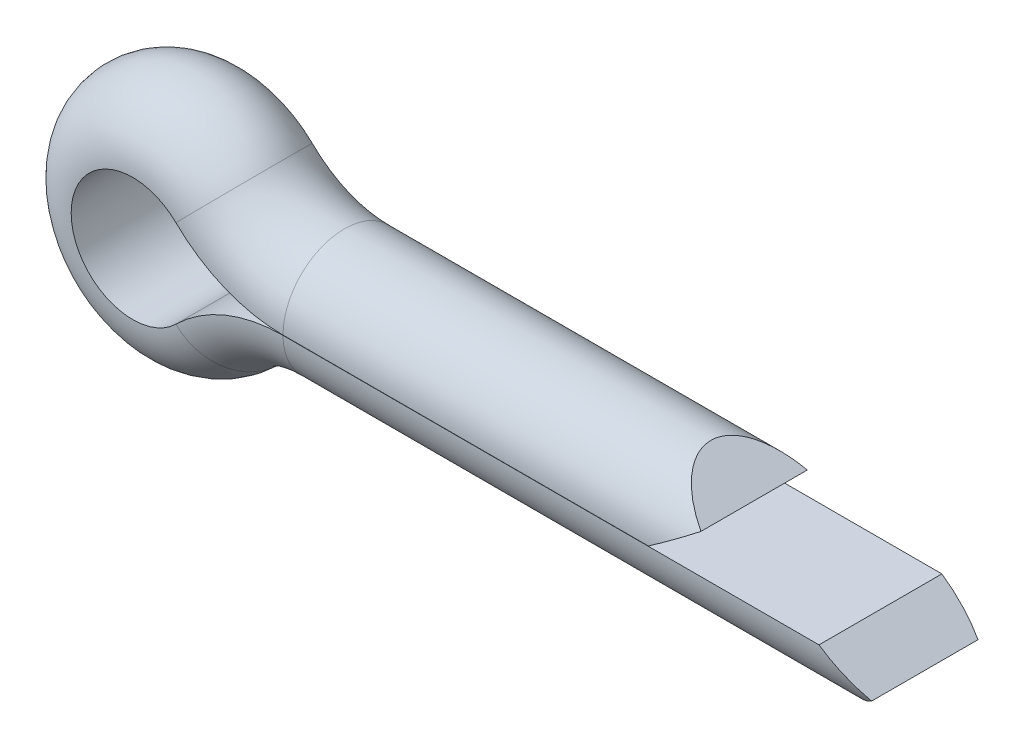
ISO-10303-21;
HEADER;
FILE_DESCRIPTION(('STEP AP214'),'2;1');
FILE_NAME('part.step','',(''),(''),'','','');
FILE_SCHEMA(('AUTOMOTIVE_DESIGN { 1 0 10303 214 1 1 1 1 }'));
ENDSEC;
DATA;
#1=APPLICATION_CONTEXT('core data for automotive mechanical design processes');
#2=APPLICATION_PROTOCOL_DEFINITION('international standard','automotive_design',2000,#1);
#3=PRODUCT_CONTEXT('',#1,'mechanical');
#4=PRODUCT('Part','Part','',(#3));
#5=PRODUCT_RELATED_PRODUCT_CATEGORY('part','',(#4));
#6=PRODUCT_DEFINITION_FORMATION('','',#4);
#7=PRODUCT_DEFINITION_CONTEXT('part definition',#1,'design');
#8=PRODUCT_DEFINITION('design','',#6,#7);
#9=PRODUCT_DEFINITION_SHAPE('','',#8);
#10=(LENGTH_UNIT() NAMED_UNIT(*) SI_UNIT(.MILLI.,.METRE.));
#11=(NAMED_UNIT(*) PLANE_ANGLE_UNIT() SI_UNIT($,.RADIAN.));
#12=(NAMED_UNIT(*) SI_UNIT($,.STERADIAN.) SOLID_ANGLE_UNIT());
#13=UNCERTAINTY_MEASURE_WITH_UNIT(LENGTH_MEASURE(1.E-05),#10,'distance_accuracy_value','');
#14=(GEOMETRIC_REPRESENTATION_CONTEXT(3) GLOBAL_UNCERTAINTY_ASSIGNED_CONTEXT((#13)) GLOBAL_UNIT_ASSIGNED_CONTEXT((#10,
#11,#12)) REPRESENTATION_CONTEXT('',''));
#15=CARTESIAN_POINT('',(0.,0.,0.));
#16=DIRECTION('',(0.,0.,1.));
#17=DIRECTION('',(1.,0.,0.));
#18=AXIS2_PLACEMENT_3D('',#15,#16,#17);
#19=CARTESIAN_POINT('',(0.,-0.00200000000000005,0.899997777775034));
#20=DIRECTION('',(0.,-1.,0.));
#21=DIRECTION('',(1.,0.,0.));
#22=AXIS2_PLACEMENT_3D('',#19,#20,#21);
#23=PLANE('',#22);
#24=DIRECTION('',(1.,0.,0.));
#25=VECTOR('',#24,1.);
#26=CARTESIAN_POINT('',(0.,-0.00200000000000005,0.899997777775034));
#27=LINE('',#26,#25);
#28=CARTESIAN_POINT('',(0.,-0.00200000000000005,0.899997777775034));
#29=VERTEX_POINT('',#28);
#30=CARTESIAN_POINT('',(7.85028587632817,-0.00199999999999918,0.899997777775034));
#31=VERTEX_POINT('',#30);
#32=EDGE_CURVE('E40',#29,#31,#27,.T.);
#33=ORIENTED_EDGE('',*,*,#32,.T.);
#34=DIRECTION('',(0.,0.,-1.));
#35=VECTOR('',#34,1.);
#36=CARTESIAN_POINT('',(7.85028587632817,-0.00200000000000025,0.899997777775034));
#37=LINE('',#36,#35);
#38=CARTESIAN_POINT('',(7.85028587632817,-0.00199999999999918,-0.899997777775034));
#39=VERTEX_POINT('',#38);
#40=EDGE_CURVE('E96',#31,#39,#37,.T.);
#41=ORIENTED_EDGE('',*,*,#40,.T.);
#42=DIRECTION('',(1.,0.,0.));
#43=VECTOR('',#42,1.);
#44=CARTESIAN_POINT('',(0.,-0.00200000000000005,-0.899997777775034));
#45=LINE('',#44,#43);
#46=CARTESIAN_POINT('',(0.,-0.00200000000000005,-0.899997777775034));
#47=VERTEX_POINT('',#46);
#48=EDGE_CURVE('E11',#47,#39,#45,.T.);
#49=ORIENTED_EDGE('',*,*,#48,.F.);
#50=DIRECTION('',(0.,0.,-1.));
#51=VECTOR('',#50,1.);
#52=CARTESIAN_POINT('',(0.,-0.00200000000000005,0.899997777775034));
#53=LINE('',#52,#51);
#54=EDGE_CURVE('E113',#29,#47,#53,.T.);
#55=ORIENTED_EDGE('',*,*,#54,.F.);
#56=EDGE_LOOP('',(#33,#41,#49,#55));
#57=FACE_BOUND('',#56,.T.);
#58=ADVANCED_FACE('F33',(#57),#23,.F.);
#59=CARTESIAN_POINT('',(0.,0.,0.));
#60=DIRECTION('',(1.,0.,0.));
#61=DIRECTION('',(0.,1.,0.));
#62=AXIS2_PLACEMENT_3D('',#59,#60,#61);
#63=CYLINDRICAL_SURFACE('',#62,0.9);
#64=CARTESIAN_POINT('',(9.13572971094684,0.,0.));
#65=DIRECTION('',(-0.578607904277823,0.815605844208601,0.));
#66=DIRECTION('',(0.815605844208601,0.578607904277824,0.));
#67=AXIS2_PLACEMENT_3D('',#64,#65,#66);
#68=ELLIPSE('',#67,1.55545749262329,0.9);
#69=CARTESIAN_POINT('',(8.50000000000002,-0.450999999999997,-0.778844657168554));
#70=VERTEX_POINT('',#69);
#71=CARTESIAN_POINT('',(8.50000000000003,-0.451,0.778844657168554));
#72=VERTEX_POINT('',#71);
#73=EDGE_CURVE('E110',#70,#72,#68,.T.);
#74=ORIENTED_EDGE('',*,*,#73,.T.);
#75=CARTESIAN_POINT('',(7.84739182677953,0.,0.));
#76=DIRECTION('',(-0.568523234922219,-0.822667205711748,0.));
#77=DIRECTION('',(0.822667205711748,-0.568523234922219,0.));
#78=AXIS2_PLACEMENT_3D('',#75,#76,#77);
#79=ELLIPSE('',#78,1.58304875635053,0.9);
#80=EDGE_CURVE('E99',#72,#31,#79,.T.);
#81=ORIENTED_EDGE('',*,*,#80,.T.);
#82=ORIENTED_EDGE('',*,*,#32,.F.);
#83=CARTESIAN_POINT('',(0.,0.,0.));
#84=DIRECTION('',(-1.,0.,0.));
#85=DIRECTION('',(0.,0.,-1.));
#86=AXIS2_PLACEMENT_3D('',#83,#84,#85);
#87=CIRCLE('',#86,0.9);
#88=EDGE_CURVE('E123',#47,#29,#87,.T.);
#89=ORIENTED_EDGE('',*,*,#88,.F.);
#90=ORIENTED_EDGE('',*,*,#48,.T.);
#91=EDGE_CURVE('E101',#39,#70,#79,.T.);
#92=ORIENTED_EDGE('',*,*,#91,.T.);
#93=EDGE_LOOP('',(#74,#81,#82,#89,#90,#92));
#94=FACE_BOUND('',#93,.T.);
#95=ADVANCED_FACE('F107',(#94),#63,.T.);
#96=CARTESIAN_POINT('',(0.,-2.23888888888889,0.));
#97=DIRECTION('',(0.,0.,-1.));
#98=DIRECTION('',(-1.,0.,0.));
#99=AXIS2_PLACEMENT_3D('',#96,#97,#98);
#100=CYLINDRICAL_SURFACE('',#99,2.23688888888889);
#101=DIRECTION('',(0.,0.,-1.));
#102=VECTOR('',#101,1.);
#103=CARTESIAN_POINT('',(-1.5678017699115,-0.643373451327425,0.899997777775034));
#104=LINE('',#103,#102);
#105=CARTESIAN_POINT('',(-1.5678017699115,-0.643373451327425,0.899997777775034));
#106=VERTEX_POINT('',#105);
#107=CARTESIAN_POINT('',(-1.5678017699115,-0.643373451327425,-0.899997777775034));
#108=VERTEX_POINT('',#107);
#109=EDGE_CURVE('E131',#106,#108,#104,.T.);
#110=ORIENTED_EDGE('',*,*,#109,.F.);
#111=CARTESIAN_POINT('',(0.,-2.23888888888889,0.899997777775034));
#112=DIRECTION('',(0.,0.,-1.));
#113=DIRECTION('',(-1.,0.,0.));
#114=AXIS2_PLACEMENT_3D('',#111,#112,#113);
#115=CIRCLE('',#114,2.23688888888889);
#116=EDGE_CURVE('E117',#106,#29,#115,.T.);
#117=ORIENTED_EDGE('',*,*,#116,.T.);
#118=ORIENTED_EDGE('',*,*,#54,.T.);
#119=CARTESIAN_POINT('',(0.,-2.23888888888889,-0.899997777775034));
#120=DIRECTION('',(0.,0.,-1.));
#121=DIRECTION('',(-1.,0.,0.));
#122=AXIS2_PLACEMENT_3D('',#119,#120,#121);
#123=CIRCLE('',#122,2.23688888888889);
#124=EDGE_CURVE('E115',#108,#47,#123,.T.);
#125=ORIENTED_EDGE('',*,*,#124,.F.);
#126=EDGE_LOOP('',(#110,#117,#118,#125));
#127=FACE_BOUND('',#126,.T.);
#128=ADVANCED_FACE('F196',(#127),#100,.T.);
#129=CARTESIAN_POINT('',(0.,-2.23888888888889,0.));
#130=DIRECTION('',(0.,0.,-1.));
#131=DIRECTION('',(-1.,0.,0.));
#132=AXIS2_PLACEMENT_3D('',#129,#130,#131);
#133=TOROIDAL_SURFACE('',#132,2.23888888888889,0.9);
#134=CARTESIAN_POINT('',(-1.569203539823,-0.641946902654858,0.));
#135=DIRECTION('',(-0.713274336283177,-0.700884955752222,0.));
#136=DIRECTION('',(0.,0.,-1.));
#137=AXIS2_PLACEMENT_3D('',#134,#135,#136);
#138=CIRCLE('',#137,0.9);
#139=EDGE_CURVE('E134',#108,#106,#138,.T.);
#140=ORIENTED_EDGE('',*,*,#139,.F.);
#141=ORIENTED_EDGE('',*,*,#124,.T.);
#142=ORIENTED_EDGE('',*,*,#88,.T.);
#143=ORIENTED_EDGE('',*,*,#116,.F.);
#144=EDGE_LOOP('',(#140,#141,#142,#143));
#145=FACE_BOUND('',#144,.T.);
#146=ADVANCED_FACE('F198',(#145),#133,.T.);
#147=CARTESIAN_POINT('',(-2.2,0.,0.));
#148=DIRECTION('',(0.,0.,1.));
#149=DIRECTION('',(1.,0.,0.));
#150=AXIS2_PLACEMENT_3D('',#147,#148,#149);
#151=CYLINDRICAL_SURFACE('',#150,0.902);
#152=DIRECTION('',(0.,0.,-1.));
#153=VECTOR('',#152,1.);
#154=CARTESIAN_POINT('',(-1.5678017699115,0.643373451327434,0.899997777775034));
#155=LINE('',#154,#153);
#156=CARTESIAN_POINT('',(-1.5678017699115,0.643373451327434,0.899997777775034));
#157=VERTEX_POINT('',#156);
#158=CARTESIAN_POINT('',(-1.5678017699115,0.643373451327434,-0.899997777775034));
#159=VERTEX_POINT('',#158);
#160=EDGE_CURVE('E143',#157,#159,#155,.T.);
#161=ORIENTED_EDGE('',*,*,#160,.F.);
#162=CARTESIAN_POINT('',(-2.2,0.,0.899997777775034));
#163=DIRECTION('',(0.,0.,1.));
#164=DIRECTION('',(1.,0.,0.));
#165=AXIS2_PLACEMENT_3D('',#162,#163,#164);
#166=CIRCLE('',#165,0.902);
#167=EDGE_CURVE('E128',#157,#106,#166,.T.);
#168=ORIENTED_EDGE('',*,*,#167,.T.);
#169=ORIENTED_EDGE('',*,*,#109,.T.);
#170=CARTESIAN_POINT('',(-2.2,0.,-0.899997777775034));
#171=DIRECTION('',(0.,0.,1.));
#172=DIRECTION('',(1.,0.,0.));
#173=AXIS2_PLACEMENT_3D('',#170,#171,#172);
#174=CIRCLE('',#173,0.902);
#175=EDGE_CURVE('E125',#159,#108,#174,.T.);
#176=ORIENTED_EDGE('',*,*,#175,.F.);
#177=EDGE_LOOP('',(#161,#168,#169,#176));
#178=FACE_BOUND('',#177,.T.);
#179=ADVANCED_FACE('F193',(#178),#151,.F.);
#180=CARTESIAN_POINT('',(-2.2,0.,0.));
#181=DIRECTION('',(0.,0.,1.));
#182=DIRECTION('',(1.,0.,0.));
#183=AXIS2_PLACEMENT_3D('',#180,#181,#182);
#184=TOROIDAL_SURFACE('',#183,0.9,0.9);
#185=CARTESIAN_POINT('',(-1.56920353982301,0.641946902654868,0.));
#186=DIRECTION('',(0.713274336283185,-0.700884955752213,0.));
#187=DIRECTION('',(0.,0.,-1.));
#188=AXIS2_PLACEMENT_3D('',#185,#186,#187);
#189=CIRCLE('',#188,0.9);
#190=EDGE_CURVE('E146',#159,#157,#189,.T.);
#191=ORIENTED_EDGE('',*,*,#190,.F.);
#192=ORIENTED_EDGE('',*,*,#175,.T.);
#193=ORIENTED_EDGE('',*,*,#139,.T.);
#194=ORIENTED_EDGE('',*,*,#167,.F.);
#195=EDGE_LOOP('',(#191,#192,#193,#194));
#196=FACE_BOUND('',#195,.T.);
#197=ADVANCED_FACE('F190',(#196),#184,.T.);
#198=CARTESIAN_POINT('',(0.,2.23888888888889,0.));
#199=DIRECTION('',(0.,0.,-1.));
#200=DIRECTION('',(-1.,0.,0.));
#201=AXIS2_PLACEMENT_3D('',#198,#199,#200);
#202=CYLINDRICAL_SURFACE('',#201,2.23688888888889);
#203=DIRECTION('',(0.,0.,-1.));
#204=VECTOR('',#203,1.);
#205=CARTESIAN_POINT('',(0.,0.002,0.899997777775034));
#206=LINE('',#205,#204);
#207=CARTESIAN_POINT('',(0.,0.002,0.899997777775034));
#208=VERTEX_POINT('',#207);
#209=CARTESIAN_POINT('',(0.,0.002,-0.899997777775034));
#210=VERTEX_POINT('',#209);
#211=EDGE_CURVE('E153',#208,#210,#206,.T.);
#212=ORIENTED_EDGE('',*,*,#211,.F.);
#213=CARTESIAN_POINT('',(0.,2.23888888888889,0.899997777775034));
#214=DIRECTION('',(0.,0.,-1.));
#215=DIRECTION('',(-1.,0.,0.));
#216=AXIS2_PLACEMENT_3D('',#213,#214,#215);
#217=CIRCLE('',#216,2.23688888888889);
#218=EDGE_CURVE('E140',#208,#157,#217,.T.);
#219=ORIENTED_EDGE('',*,*,#218,.T.);
#220=ORIENTED_EDGE('',*,*,#160,.T.);
#221=CARTESIAN_POINT('',(0.,2.23888888888889,-0.899997777775034));
#222=DIRECTION('',(0.,0.,-1.));
#223=DIRECTION('',(-1.,0.,0.));
#224=AXIS2_PLACEMENT_3D('',#221,#222,#223);
#225=CIRCLE('',#224,2.23688888888889);
#226=EDGE_CURVE('E137',#210,#159,#225,.T.);
#227=ORIENTED_EDGE('',*,*,#226,.F.);
#228=EDGE_LOOP('',(#212,#219,#220,#227));
#229=FACE_BOUND('',#228,.T.);
#230=ADVANCED_FACE('F184',(#229),#202,.T.);
#231=CARTESIAN_POINT('',(0.,2.23888888888889,0.));
#232=DIRECTION('',(0.,0.,-1.));
#233=DIRECTION('',(-1.,0.,0.));
#234=AXIS2_PLACEMENT_3D('',#231,#232,#233);
#235=TOROIDAL_SURFACE('',#234,2.23888888888889,0.9);
#236=CARTESIAN_POINT('',(0.,0.,0.));
#237=DIRECTION('',(1.,0.,0.));
#238=DIRECTION('',(0.,0.,-1.));
#239=AXIS2_PLACEMENT_3D('',#236,#237,#238);
#240=CIRCLE('',#239,0.9);
#241=EDGE_CURVE('E158',#210,#208,#240,.T.);
#242=ORIENTED_EDGE('',*,*,#241,.F.);
#243=ORIENTED_EDGE('',*,*,#226,.T.);
#244=ORIENTED_EDGE('',*,*,#190,.T.);
#245=ORIENTED_EDGE('',*,*,#218,.F.);
#246=EDGE_LOOP('',(#242,#243,#244,#245));
#247=FACE_BOUND('',#246,.T.);
#248=ADVANCED_FACE('F187',(#247),#235,.T.);
#249=CARTESIAN_POINT('',(0.,0.,0.));
#250=DIRECTION('',(1.,0.,0.));
#251=DIRECTION('',(0.,0.,-1.));
#252=AXIS2_PLACEMENT_3D('',#249,#250,#251);
#253=CYLINDRICAL_SURFACE('',#252,0.9);
#254=CARTESIAN_POINT('',(5.3473918267795,0.,0.));
#255=DIRECTION('',(-0.568523234922219,0.822667205711748,0.));
#256=DIRECTION('',(0.822667205711748,0.568523234922219,0.));
#257=AXIS2_PLACEMENT_3D('',#254,#255,#256);
#258=ELLIPSE('',#257,1.58304875635053,0.9);
#259=CARTESIAN_POINT('',(6.,0.451,0.778844657168553));
#260=VERTEX_POINT('',#259);
#261=CARTESIAN_POINT('',(5.35028587632815,0.002,0.899997777775034));
#262=VERTEX_POINT('',#261);
#263=EDGE_CURVE('E47',#260,#262,#258,.F.);
#264=ORIENTED_EDGE('',*,*,#263,.F.);
#265=CARTESIAN_POINT('',(6.63572971094681,0.,0.));
#266=DIRECTION('',(-0.578607904277824,-0.815605844208601,0.));
#267=DIRECTION('',(0.815605844208601,-0.578607904277824,0.));
#268=AXIS2_PLACEMENT_3D('',#265,#266,#267);
#269=ELLIPSE('',#268,1.55545749262329,0.9);
#270=CARTESIAN_POINT('',(6.,0.451,-0.778844657168553));
#271=VERTEX_POINT('',#270);
#272=EDGE_CURVE('E166',#271,#260,#269,.F.);
#273=ORIENTED_EDGE('',*,*,#272,.F.);
#274=CARTESIAN_POINT('',(5.35028587632815,0.00200000000000013,-0.899997777775034));
#275=VERTEX_POINT('',#274);
#276=EDGE_CURVE('E162',#275,#271,#258,.F.);
#277=ORIENTED_EDGE('',*,*,#276,.F.);
#278=DIRECTION('',(1.,0.,0.));
#279=VECTOR('',#278,1.);
#280=CARTESIAN_POINT('',(0.,0.002,-0.899997777775034));
#281=LINE('',#280,#279);
#282=EDGE_CURVE('E149',#210,#275,#281,.T.);
#283=ORIENTED_EDGE('',*,*,#282,.F.);
#284=ORIENTED_EDGE('',*,*,#241,.T.);
#285=DIRECTION('',(1.,0.,0.));
#286=VECTOR('',#285,1.);
#287=CARTESIAN_POINT('',(0.,0.002,0.899997777775034));
#288=LINE('',#287,#286);
#289=EDGE_CURVE('E150',#208,#262,#288,.T.);
#290=ORIENTED_EDGE('',*,*,#289,.T.);
#291=EDGE_LOOP('',(#264,#273,#277,#283,#284,#290));
#292=FACE_BOUND('',#291,.T.);
#293=ADVANCED_FACE('F176',(#292),#253,.T.);
#294=CARTESIAN_POINT('',(0.,0.002,0.899997777775034));
#295=DIRECTION('',(0.,-1.,0.));
#296=DIRECTION('',(0.,0.,-1.));
#297=AXIS2_PLACEMENT_3D('',#294,#295,#296);
#298=PLANE('',#297);
#299=DIRECTION('',(0.,0.,-1.));
#300=VECTOR('',#299,1.);
#301=CARTESIAN_POINT('',(5.35028587632815,0.002,0.899997777775034));
#302=LINE('',#301,#300);
#303=EDGE_CURVE('E164',#262,#275,#302,.T.);
#304=ORIENTED_EDGE('',*,*,#303,.F.);
#305=ORIENTED_EDGE('',*,*,#289,.F.);
#306=ORIENTED_EDGE('',*,*,#211,.T.);
#307=ORIENTED_EDGE('',*,*,#282,.T.);
#308=EDGE_LOOP('',(#304,#305,#306,#307));
#309=FACE_BOUND('',#308,.T.);
#310=ADVANCED_FACE('F181',(#309),#298,.T.);
#311=CARTESIAN_POINT('',(6.,0.451,-0.899997777775034));
#312=DIRECTION('',(-0.568523234922219,0.822667205711748,0.));
#313=DIRECTION('',(-0.822667205711748,-0.568523234922219,0.));
#314=AXIS2_PLACEMENT_3D('',#311,#312,#313);
#315=PLANE('',#314);
#316=ORIENTED_EDGE('',*,*,#263,.T.);
#317=ORIENTED_EDGE('',*,*,#303,.T.);
#318=ORIENTED_EDGE('',*,*,#276,.T.);
#319=DIRECTION('',(0.,0.,1.));
#320=VECTOR('',#319,1.);
#321=CARTESIAN_POINT('',(6.,0.451,-0.899997777775034));
#322=LINE('',#321,#320);
#323=EDGE_CURVE('E168',#271,#260,#322,.T.);
#324=ORIENTED_EDGE('',*,*,#323,.T.);
#325=EDGE_LOOP('',(#316,#317,#318,#324));
#326=FACE_BOUND('',#325,.T.);
#327=ADVANCED_FACE('F171',(#326),#315,.F.);
#328=CARTESIAN_POINT('',(6.,0.451,-0.899997777775034));
#329=DIRECTION('',(-0.578607904277824,-0.815605844208601,0.));
#330=DIRECTION('',(0.815605844208601,-0.578607904277824,0.));
#331=AXIS2_PLACEMENT_3D('',#328,#329,#330);
#332=PLANE('',#331);
#333=ORIENTED_EDGE('',*,*,#272,.T.);
#334=ORIENTED_EDGE('',*,*,#323,.F.);
#335=EDGE_LOOP('',(#333,#334));
#336=FACE_BOUND('',#335,.T.);
#337=ADVANCED_FACE('F277',(#336),#332,.F.);
#338=CARTESIAN_POINT('',(8.50000000000003,-0.451,-0.899997777775034));
#339=DIRECTION('',(-0.578607904277823,0.815605844208601,0.));
#340=DIRECTION('',(-0.815605844208601,-0.578607904277824,0.));
#341=AXIS2_PLACEMENT_3D('',#338,#339,#340);
#342=PLANE('',#341);
#343=DIRECTION('',(0.,0.,1.));
#344=VECTOR('',#343,1.);
#345=CARTESIAN_POINT('',(8.50000000000003,-0.451,-0.899997777775034));
#346=LINE('',#345,#344);
#347=EDGE_CURVE('E55',#70,#72,#346,.T.);
#348=ORIENTED_EDGE('',*,*,#347,.T.);
#349=ORIENTED_EDGE('',*,*,#73,.F.);
#350=EDGE_LOOP('',(#348,#349));
#351=FACE_BOUND('',#350,.T.);
#352=ADVANCED_FACE('F284',(#351),#342,.F.);
#353=CARTESIAN_POINT('',(8.50000000000003,-0.451,-0.899997777775034));
#354=DIRECTION('',(-0.568523234922219,-0.822667205711748,0.));
#355=DIRECTION('',(0.822667205711748,-0.568523234922219,0.));
#356=AXIS2_PLACEMENT_3D('',#353,#354,#355);
#357=PLANE('',#356);
#358=ORIENTED_EDGE('',*,*,#347,.F.);
#359=ORIENTED_EDGE('',*,*,#91,.F.);
#360=ORIENTED_EDGE('',*,*,#40,.F.);
#361=ORIENTED_EDGE('',*,*,#80,.F.);
#362=EDGE_LOOP('',(#358,#359,#360,#361));
#363=FACE_BOUND('',#362,.T.);
#364=ADVANCED_FACE('F98',(#363),#357,.F.);
#365=CLOSED_SHELL('',(#58,#95,#128,#146,#179,#197,#230,#248,#293,#310,#327,#337,#352,#364));
#366=MANIFOLD_SOLID_BREP('B2',#365);
#367=ADVANCED_BREP_SHAPE_REPRESENTATION('',(#18,#366),#14);
#368=SHAPE_DEFINITION_REPRESENTATION(#9,#367);
ENDSEC;
END-ISO-10303-21;
